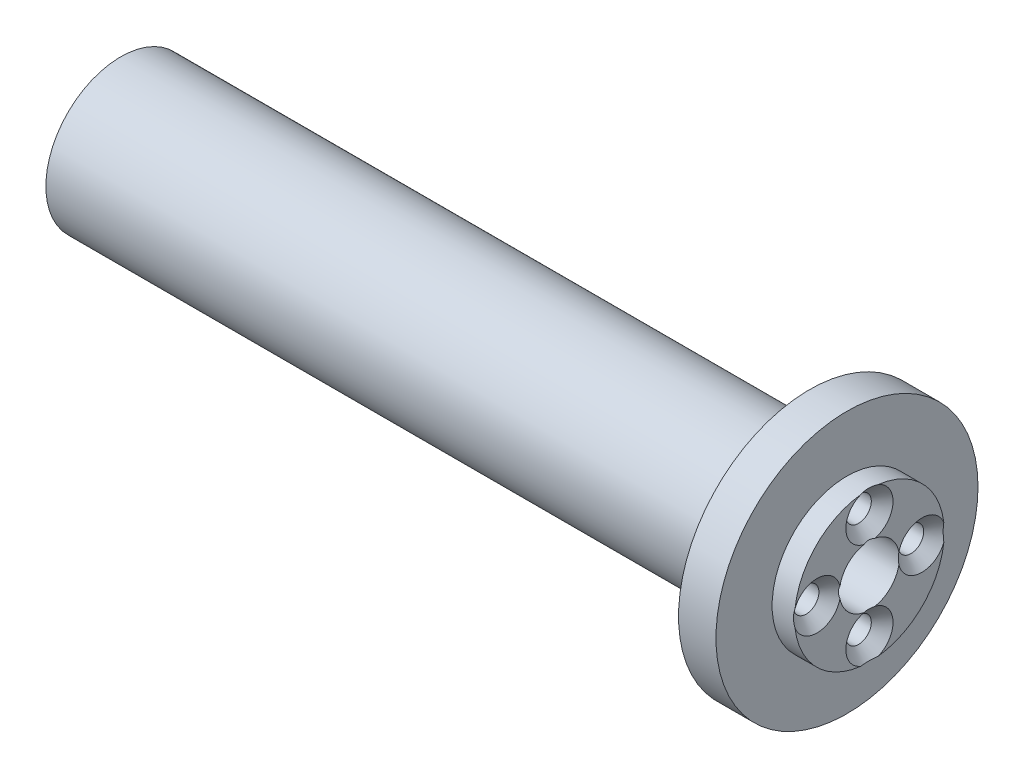
ISO-10303-21;
HEADER;
FILE_DESCRIPTION(('STEP AP214'),'2;1');
FILE_NAME('part.step','',(''),(''),'','','');
FILE_SCHEMA(('AUTOMOTIVE_DESIGN { 1 0 10303 214 1 1 1 1 }'));
ENDSEC;
DATA;
#1=APPLICATION_CONTEXT('core data for automotive mechanical design processes');
#2=APPLICATION_PROTOCOL_DEFINITION('international standard','automotive_design',2000,#1);
#3=PRODUCT_CONTEXT('',#1,'mechanical');
#4=PRODUCT('Part','Part','',(#3));
#5=PRODUCT_RELATED_PRODUCT_CATEGORY('part','',(#4));
#6=PRODUCT_DEFINITION_FORMATION('','',#4);
#7=PRODUCT_DEFINITION_CONTEXT('part definition',#1,'design');
#8=PRODUCT_DEFINITION('design','',#6,#7);
#9=PRODUCT_DEFINITION_SHAPE('','',#8);
#10=(LENGTH_UNIT() NAMED_UNIT(*) SI_UNIT(.MILLI.,.METRE.));
#11=(NAMED_UNIT(*) PLANE_ANGLE_UNIT() SI_UNIT($,.RADIAN.));
#12=(NAMED_UNIT(*) SI_UNIT($,.STERADIAN.) SOLID_ANGLE_UNIT());
#13=UNCERTAINTY_MEASURE_WITH_UNIT(LENGTH_MEASURE(1.E-05),#10,'distance_accuracy_value','');
#14=(GEOMETRIC_REPRESENTATION_CONTEXT(3) GLOBAL_UNCERTAINTY_ASSIGNED_CONTEXT((#13)) GLOBAL_UNIT_ASSIGNED_CONTEXT((#10,
#11,#12)) REPRESENTATION_CONTEXT('',''));
#15=CARTESIAN_POINT('',(0.,0.,0.));
#16=DIRECTION('',(0.,0.,1.));
#17=DIRECTION('',(1.,0.,0.));
#18=AXIS2_PLACEMENT_3D('',#15,#16,#17);
#19=CARTESIAN_POINT('',(0.,0.,0.));
#20=DIRECTION('',(-1.,0.,0.));
#21=DIRECTION('',(0.,0.,1.));
#22=AXIS2_PLACEMENT_3D('',#19,#20,#21);
#23=PLANE('',#22);
#24=CARTESIAN_POINT('',(0.,7.,0.));
#25=DIRECTION('',(1.,0.,0.));
#26=DIRECTION('',(0.,0.,-1.));
#27=AXIS2_PLACEMENT_3D('',#24,#25,#26);
#28=CIRCLE('',#27,3.15);
#29=CARTESIAN_POINT('',(0.,9.93410714285714,1.14608694008556));
#30=VERTEX_POINT('',#29);
#31=CARTESIAN_POINT('',(0.,3.93410714285714,0.72304978287833));
#32=VERTEX_POINT('',#31);
#33=EDGE_CURVE('E113',#30,#32,#28,.T.);
#34=ORIENTED_EDGE('',*,*,#33,.F.);
#35=CARTESIAN_POINT('',(0.,0.,0.));
#36=DIRECTION('',(1.,0.,0.));
#37=DIRECTION('',(0.,0.,-1.));
#38=AXIS2_PLACEMENT_3D('',#35,#36,#37);
#39=CIRCLE('',#38,10.);
#40=CARTESIAN_POINT('',(0.,1.14608694008556,9.93410714285714));
#41=VERTEX_POINT('',#40);
#42=EDGE_CURVE('E122',#30,#41,#39,.T.);
#43=ORIENTED_EDGE('',*,*,#42,.T.);
#44=CARTESIAN_POINT('',(0.,0.,7.));
#45=DIRECTION('',(1.,0.,0.));
#46=DIRECTION('',(0.,0.,-1.));
#47=AXIS2_PLACEMENT_3D('',#44,#45,#46);
#48=CIRCLE('',#47,3.15);
#49=CARTESIAN_POINT('',(0.,0.72304978287833,3.93410714285714));
#50=VERTEX_POINT('',#49);
#51=EDGE_CURVE('E209',#50,#41,#48,.T.);
#52=ORIENTED_EDGE('',*,*,#51,.F.);
#53=CARTESIAN_POINT('',(0.,0.,0.));
#54=DIRECTION('',(1.,0.,0.));
#55=DIRECTION('',(0.,0.,-1.));
#56=AXIS2_PLACEMENT_3D('',#53,#54,#55);
#57=CIRCLE('',#56,4.);
#58=EDGE_CURVE('E124',#32,#50,#57,.T.);
#59=ORIENTED_EDGE('',*,*,#58,.F.);
#60=EDGE_LOOP('',(#34,#43,#52,#59));
#61=FACE_BOUND('',#60,.T.);
#62=ADVANCED_FACE('F48',(#61),#23,.F.);
#63=CARTESIAN_POINT('',(0.,3.93410714285714,-0.72304978287833));
#64=VERTEX_POINT('',#63);
#65=CARTESIAN_POINT('',(0.,9.93410714285714,-1.14608694008555));
#66=VERTEX_POINT('',#65);
#67=EDGE_CURVE('E65',#64,#66,#28,.T.);
#68=ORIENTED_EDGE('',*,*,#67,.F.);
#69=CARTESIAN_POINT('',(0.,0.72304978287833,-3.93410714285714));
#70=VERTEX_POINT('',#69);
#71=EDGE_CURVE('E430',#70,#64,#57,.T.);
#72=ORIENTED_EDGE('',*,*,#71,.F.);
#73=CARTESIAN_POINT('',(0.,0.,-7.));
#74=DIRECTION('',(1.,0.,0.));
#75=DIRECTION('',(0.,0.,-1.));
#76=AXIS2_PLACEMENT_3D('',#73,#74,#75);
#77=CIRCLE('',#76,3.15);
#78=CARTESIAN_POINT('',(0.,1.14608694008556,-9.93410714285714));
#79=VERTEX_POINT('',#78);
#80=EDGE_CURVE('E417',#79,#70,#77,.T.);
#81=ORIENTED_EDGE('',*,*,#80,.F.);
#82=EDGE_CURVE('E132',#79,#66,#39,.T.);
#83=ORIENTED_EDGE('',*,*,#82,.T.);
#84=EDGE_LOOP('',(#68,#72,#81,#83));
#85=FACE_BOUND('',#84,.T.);
#86=ADVANCED_FACE('F289',(#85),#23,.F.);
#87=CARTESIAN_POINT('',(0.,-0.72304978287833,-3.93410714285714));
#88=VERTEX_POINT('',#87);
#89=CARTESIAN_POINT('',(0.,-1.14608694008555,-9.93410714285714));
#90=VERTEX_POINT('',#89);
#91=EDGE_CURVE('E72',#88,#90,#77,.T.);
#92=ORIENTED_EDGE('',*,*,#91,.F.);
#93=CARTESIAN_POINT('',(0.,-3.93410714285714,-0.72304978287833));
#94=VERTEX_POINT('',#93);
#95=EDGE_CURVE('E138',#94,#88,#57,.T.);
#96=ORIENTED_EDGE('',*,*,#95,.F.);
#97=CARTESIAN_POINT('',(0.,-7.,0.));
#98=DIRECTION('',(1.,0.,0.));
#99=DIRECTION('',(0.,0.,-1.));
#100=AXIS2_PLACEMENT_3D('',#97,#98,#99);
#101=CIRCLE('',#100,3.15);
#102=CARTESIAN_POINT('',(0.,-9.93410714285714,-1.14608694008556));
#103=VERTEX_POINT('',#102);
#104=EDGE_CURVE('E155',#103,#94,#101,.T.);
#105=ORIENTED_EDGE('',*,*,#104,.F.);
#106=EDGE_CURVE('E136',#103,#90,#39,.T.);
#107=ORIENTED_EDGE('',*,*,#106,.T.);
#108=EDGE_LOOP('',(#92,#96,#105,#107));
#109=FACE_BOUND('',#108,.T.);
#110=ADVANCED_FACE('F152',(#109),#23,.F.);
#111=CARTESIAN_POINT('',(0.,-1.14608694008556,9.93410714285714));
#112=VERTEX_POINT('',#111);
#113=CARTESIAN_POINT('',(0.,-9.93410714285714,1.14608694008555));
#114=VERTEX_POINT('',#113);
#115=EDGE_CURVE('E135',#112,#114,#39,.T.);
#116=ORIENTED_EDGE('',*,*,#115,.T.);
#117=CARTESIAN_POINT('',(0.,-3.93410714285714,0.72304978287833));
#118=VERTEX_POINT('',#117);
#119=EDGE_CURVE('E198',#118,#114,#101,.T.);
#120=ORIENTED_EDGE('',*,*,#119,.F.);
#121=CARTESIAN_POINT('',(0.,-0.72304978287833,3.93410714285714));
#122=VERTEX_POINT('',#121);
#123=EDGE_CURVE('E133',#122,#118,#57,.T.);
#124=ORIENTED_EDGE('',*,*,#123,.F.);
#125=EDGE_CURVE('E253',#112,#122,#48,.T.);
#126=ORIENTED_EDGE('',*,*,#125,.F.);
#127=EDGE_LOOP('',(#116,#120,#124,#126));
#128=FACE_BOUND('',#127,.T.);
#129=ADVANCED_FACE('F263',(#128),#23,.F.);
#130=CARTESIAN_POINT('',(-8.,0.,0.));
#131=DIRECTION('',(-1.,0.,0.));
#132=DIRECTION('',(0.,0.,1.));
#133=AXIS2_PLACEMENT_3D('',#130,#131,#132);
#134=PLANE('',#133);
#135=CARTESIAN_POINT('',(-8.,7.,0.));
#136=DIRECTION('',(-1.,0.,0.));
#137=DIRECTION('',(0.,0.,1.));
#138=AXIS2_PLACEMENT_3D('',#135,#136,#137);
#139=CIRCLE('',#138,1.69999999999999);
#140=CARTESIAN_POINT('',(-8.,7.,1.69999999999999));
#141=VERTEX_POINT('',#140);
#142=EDGE_CURVE('E53',#141,#141,#139,.T.);
#143=ORIENTED_EDGE('',*,*,#142,.F.);
#144=EDGE_LOOP('',(#143));
#145=FACE_BOUND('',#144,.T.);
#146=CARTESIAN_POINT('',(-8.,0.,-7.));
#147=DIRECTION('',(-1.,0.,0.));
#148=DIRECTION('',(0.,0.,1.));
#149=AXIS2_PLACEMENT_3D('',#146,#147,#148);
#150=CIRCLE('',#149,1.69999999999999);
#151=CARTESIAN_POINT('',(-8.,0.,-5.30000000000001));
#152=VERTEX_POINT('',#151);
#153=EDGE_CURVE('E170',#152,#152,#150,.T.);
#154=ORIENTED_EDGE('',*,*,#153,.F.);
#155=EDGE_LOOP('',(#154));
#156=FACE_BOUND('',#155,.T.);
#157=CARTESIAN_POINT('',(-8.,-7.,0.));
#158=DIRECTION('',(-1.,0.,0.));
#159=DIRECTION('',(0.,0.,1.));
#160=AXIS2_PLACEMENT_3D('',#157,#158,#159);
#161=CIRCLE('',#160,1.69999999999999);
#162=CARTESIAN_POINT('',(-8.,-7.,1.69999999999999));
#163=VERTEX_POINT('',#162);
#164=EDGE_CURVE('E169',#163,#163,#161,.T.);
#165=ORIENTED_EDGE('',*,*,#164,.F.);
#166=EDGE_LOOP('',(#165));
#167=FACE_BOUND('',#166,.T.);
#168=CARTESIAN_POINT('',(-8.,0.,7.));
#169=DIRECTION('',(-1.,0.,0.));
#170=DIRECTION('',(0.,0.,1.));
#171=AXIS2_PLACEMENT_3D('',#168,#169,#170);
#172=CIRCLE('',#171,1.69999999999999);
#173=CARTESIAN_POINT('',(-8.,0.,8.69999999999999));
#174=VERTEX_POINT('',#173);
#175=EDGE_CURVE('E224',#174,#174,#172,.T.);
#176=ORIENTED_EDGE('',*,*,#175,.F.);
#177=EDGE_LOOP('',(#176));
#178=FACE_BOUND('',#177,.T.);
#179=CARTESIAN_POINT('',(-8.,0.,0.));
#180=DIRECTION('',(-1.,0.,0.));
#181=DIRECTION('',(0.,0.,1.));
#182=AXIS2_PLACEMENT_3D('',#179,#180,#181);
#183=CIRCLE('',#182,4.);
#184=CARTESIAN_POINT('',(-8.,0.,4.));
#185=VERTEX_POINT('',#184);
#186=EDGE_CURVE('E227',#185,#185,#183,.F.);
#187=ORIENTED_EDGE('',*,*,#186,.T.);
#188=EDGE_LOOP('',(#187));
#189=FACE_BOUND('',#188,.T.);
#190=CARTESIAN_POINT('',(-8.,0.,0.));
#191=DIRECTION('',(1.,0.,0.));
#192=DIRECTION('',(0.,0.,-1.));
#193=AXIS2_PLACEMENT_3D('',#190,#191,#192);
#194=CIRCLE('',#193,17.5);
#195=CARTESIAN_POINT('',(-8.,0.,-17.5));
#196=VERTEX_POINT('',#195);
#197=EDGE_CURVE('E234',#196,#196,#194,.T.);
#198=ORIENTED_EDGE('',*,*,#197,.F.);
#199=EDGE_LOOP('',(#198));
#200=FACE_BOUND('',#199,.T.);
#201=ADVANCED_FACE('F241',(#145,#156,#167,#178,#189,#200),#134,.T.);
#202=CARTESIAN_POINT('',(0.,0.,0.));
#203=DIRECTION('',(1.,0.,0.));
#204=DIRECTION('',(0.,0.,-1.));
#205=AXIS2_PLACEMENT_3D('',#202,#203,#204);
#206=CYLINDRICAL_SURFACE('',#205,10.);
#207=ORIENTED_EDGE('',*,*,#42,.F.);
#208=CARTESIAN_POINT('',(1.10529391328423,9.34946240796902,3.5478941193297));
#209=CARTESIAN_POINT('',(1.04907264829997,9.38364431797027,3.45780962183444));
#210=CARTESIAN_POINT('',(0.993594835934076,9.4166869097311,3.3668177564348));
#211=CARTESIAN_POINT('',(0.884461815923228,9.48043414001423,3.18290101992952));
#212=CARTESIAN_POINT('',(0.83080719180688,9.51113803384624,3.08997554501497));
#213=CARTESIAN_POINT('',(0.725325809001813,9.57033248267158,2.90147530933876));
#214=CARTESIAN_POINT('',(0.673514407773661,9.59880610815127,2.80588659186287));
#215=CARTESIAN_POINT('',(0.572583653684765,9.65320832212306,2.61259477999553));
#216=CARTESIAN_POINT('',(0.523464079923835,9.67913711959063,2.51489186002308));
#217=CARTESIAN_POINT('',(0.427369925636187,9.72891314252906,2.31497255611052));
#218=CARTESIAN_POINT('',(0.380470879722207,9.75269861532267,2.21270404664197));
#219=CARTESIAN_POINT('',(0.290791560299733,9.79735495590047,2.0057560239992));
#220=CARTESIAN_POINT('',(0.248011962655517,9.81822534566879,1.90107611867464));
#221=CARTESIAN_POINT('',(0.127352684735384,9.87609892913062,1.58388676876449));
#222=CARTESIAN_POINT('',(0.0568077596554927,9.90853954210883,1.36753486741728));
#223=CARTESIAN_POINT('',(-0.0299217344374776,9.94757410537813,1.02944641862924));
#224=CARTESIAN_POINT('',(-0.056097238175055,9.95915953184833,0.910803937255921));
#225=CARTESIAN_POINT('',(-0.0993679839851817,9.97815090974477,0.671489447209664));
#226=CARTESIAN_POINT('',(-0.116462357099749,9.9855564612101,0.550817245455592));
#227=CARTESIAN_POINT('',(-0.140513350068538,9.99593844318791,0.309335401118566));
#228=CARTESIAN_POINT('',(-0.147557671734934,9.99895319492118,0.188536270013584));
#229=CARTESIAN_POINT('',(-0.151374268212403,10.0005890243352,-0.0532180578452432));
#230=CARTESIAN_POINT('',(-0.148149341106092,9.99921129884276,-0.174173203112497));
#231=CARTESIAN_POINT('',(-0.130003390427934,9.99140867101323,-0.438735594187811));
#232=CARTESIAN_POINT('',(-0.112928646944249,9.98405385433666,-0.582170972309429));
#233=CARTESIAN_POINT('',(-0.065699397174807,9.96340348068819,-0.866603018044164));
#234=CARTESIAN_POINT('',(-0.0355223497226249,9.9500976844755,-1.00759504545096));
#235=CARTESIAN_POINT('',(0.0771077297424815,9.89939684827125,-1.44670918999629));
#236=CARTESIAN_POINT('',(0.179718539688524,9.85191529602585,-1.73857793617781));
#237=CARTESIAN_POINT('',(0.357426215311863,9.76439775883319,-2.16278283232573));
#238=CARTESIAN_POINT('',(0.420826843194004,9.73240297256919,-2.30226885145879));
#239=CARTESIAN_POINT('',(0.553824744829527,9.66329146623199,-2.57697671140292));
#240=CARTESIAN_POINT('',(0.623420484307624,9.62617601309291,-2.7121995968455));
#241=CARTESIAN_POINT('',(0.758362001855065,9.55204882522907,-2.96195145440974));
#242=CARTESIAN_POINT('',(0.823152401180091,9.51560348975193,-3.07695511508269));
#243=CARTESIAN_POINT('',(0.955648135943759,9.4391458632028,-3.30406964338384));
#244=CARTESIAN_POINT('',(1.02335361371833,9.39913339785449,-3.41618036932891));
#245=CARTESIAN_POINT('',(1.16035158188826,9.31610755961291,-3.63646150180565));
#246=CARTESIAN_POINT('',(1.22961931897936,9.27313090371577,-3.7446612446837));
#247=CARTESIAN_POINT('',(1.36998761788798,9.18390468080928,-3.95844445788286));
#248=CARTESIAN_POINT('',(1.44108765120168,9.13765605099054,-4.064028665766));
#249=CARTESIAN_POINT('',(1.51290275681031,9.08980984860934,-4.16837581272665));
#250=B_SPLINE_CURVE_WITH_KNOTS('',3,(#208,#209,#210,#211,#212,#213,#214,#215,#216,#217,#218,
#219,#220,#221,#222,#223,#224,#225,#226,#227,#228,#229,#230,#231,#232,#233,#234,#235,#236,#237,
#238,#239,#240,#241,#242,#243,#244,#245,#246,#247,#248,#249),.UNSPECIFIED.,.F.,.F.,(4,2,2,2,2,2,
2,2,2,2,2,2,2,2,2,2,2,2,2,2,4),(0.,0.334665218809981,0.669436560360941,1.00654264201482,
1.34362101808474,1.68846868120882,2.03337282629586,2.7208107620489,3.08660554123136,
3.45243531639376,3.81505272993039,4.17757134883501,4.61062861980551,5.04443389183376,
5.97838641402409,6.44785276323829,6.91720316664569,7.32791367433452,7.73864425877521,
8.14497723005486,8.55119428304706),.UNSPECIFIED.);
#251=EDGE_CURVE('E13',#30,#66,#250,.T.);
#252=ORIENTED_EDGE('',*,*,#251,.T.);
#253=ORIENTED_EDGE('',*,*,#82,.F.);
#254=CARTESIAN_POINT('',(1.10529391328423,3.54789411932969,-9.34946240796902));
#255=CARTESIAN_POINT('',(1.04907264829997,3.45780962183444,-9.38364431797027));
#256=CARTESIAN_POINT('',(0.993594835934075,3.3668177564348,-9.4166869097311));
#257=CARTESIAN_POINT('',(0.884461815923227,3.18290101992951,-9.48043414001423));
#258=CARTESIAN_POINT('',(0.83080719180688,3.08997554501496,-9.51113803384624));
#259=CARTESIAN_POINT('',(0.725325809001813,2.90147530933876,-9.57033248267158));
#260=CARTESIAN_POINT('',(0.673514407773661,2.80588659186287,-9.59880610815127));
#261=CARTESIAN_POINT('',(0.572583653684765,2.61259477999553,-9.65320832212306));
#262=CARTESIAN_POINT('',(0.523464079923836,2.51489186002308,-9.67913711959063));
#263=CARTESIAN_POINT('',(0.427369925636188,2.31497255611052,-9.72891314252906));
#264=CARTESIAN_POINT('',(0.380470879722207,2.21270404664197,-9.75269861532267));
#265=CARTESIAN_POINT('',(0.290791560299733,2.0057560239992,-9.79735495590047));
#266=CARTESIAN_POINT('',(0.248011962655518,1.90107611867464,-9.81822534566879));
#267=CARTESIAN_POINT('',(0.127352684735384,1.58388676876449,-9.87609892913062));
#268=CARTESIAN_POINT('',(0.0568077596554936,1.36753486741728,-9.90853954210883));
#269=CARTESIAN_POINT('',(-0.0299217344374768,1.02944641862924,-9.94757410537813));
#270=CARTESIAN_POINT('',(-0.0560972381750545,0.910803937255923,-9.95915953184833));
#271=CARTESIAN_POINT('',(-0.0993679839851814,0.671489447209666,-9.97815090974477));
#272=CARTESIAN_POINT('',(-0.116462357099748,0.550817245455594,-9.9855564612101));
#273=CARTESIAN_POINT('',(-0.140513350068537,0.309335401118568,-9.99593844318791));
#274=CARTESIAN_POINT('',(-0.147557671734934,0.188536270013585,-9.99895319492118));
#275=CARTESIAN_POINT('',(-0.151374268212403,-0.0532180578452413,-10.0005890243352));
#276=CARTESIAN_POINT('',(-0.148149341106092,-0.174173203112495,-9.99921129884276));
#277=CARTESIAN_POINT('',(-0.130003390427933,-0.43873559418781,-9.99140867101323));
#278=CARTESIAN_POINT('',(-0.112928646944248,-0.582170972309428,-9.98405385433666));
#279=CARTESIAN_POINT('',(-0.0656993971748058,-0.866603018044163,-9.96340348068819));
#280=CARTESIAN_POINT('',(-0.0355223497226245,-1.00759504545096,-9.9500976844755));
#281=CARTESIAN_POINT('',(0.0771077297424805,-1.44670918999629,-9.89939684827125));
#282=CARTESIAN_POINT('',(0.179718539688524,-1.73857793617781,-9.85191529602585));
#283=CARTESIAN_POINT('',(0.357426215311863,-2.16278283232573,-9.76439775883319));
#284=CARTESIAN_POINT('',(0.420826843194004,-2.30226885145879,-9.73240297256919));
#285=CARTESIAN_POINT('',(0.553824744829527,-2.57697671140292,-9.66329146623199));
#286=CARTESIAN_POINT('',(0.623420484307623,-2.7121995968455,-9.62617601309291));
#287=CARTESIAN_POINT('',(0.758362001855065,-2.96195145440974,-9.55204882522907));
#288=CARTESIAN_POINT('',(0.823152401180092,-3.07695511508269,-9.51560348975193));
#289=CARTESIAN_POINT('',(0.955648135943759,-3.30406964338384,-9.4391458632028));
#290=CARTESIAN_POINT('',(1.02335361371833,-3.41618036932891,-9.39913339785449));
#291=CARTESIAN_POINT('',(1.16035158188826,-3.63646150180565,-9.31610755961291));
#292=CARTESIAN_POINT('',(1.22961931897936,-3.7446612446837,-9.27313090371577));
#293=CARTESIAN_POINT('',(1.36998761788798,-3.95844445788286,-9.18390468080928));
#294=CARTESIAN_POINT('',(1.44108765120168,-4.06402866576599,-9.13765605099055));
#295=CARTESIAN_POINT('',(1.51290275681031,-4.16837581272665,-9.08980984860934));
#296=B_SPLINE_CURVE_WITH_KNOTS('',3,(#254,#255,#256,#257,#258,#259,#260,#261,#262,#263,#264,
#265,#266,#267,#268,#269,#270,#271,#272,#273,#274,#275,#276,#277,#278,#279,#280,#281,#282,#283,
#284,#285,#286,#287,#288,#289,#290,#291,#292,#293,#294,#295),.UNSPECIFIED.,.F.,.F.,(4,2,2,2,2,2,
2,2,2,2,2,2,2,2,2,2,2,2,2,2,4),(0.,0.334665218809981,0.66943656036094,1.00654264201482,
1.34362101808473,1.68846868120882,2.03337282629585,2.7208107620489,3.08660554123136,
3.45243531639375,3.81505272993039,4.17757134883501,4.61062861980551,5.04443389183376,
5.97838641402409,6.44785276323829,6.91720316664569,7.32791367433452,7.7386442587752,
8.14497723005486,8.55119428304706),.UNSPECIFIED.);
#297=EDGE_CURVE('E58',#79,#90,#296,.T.);
#298=ORIENTED_EDGE('',*,*,#297,.T.);
#299=ORIENTED_EDGE('',*,*,#106,.F.);
#300=CARTESIAN_POINT('',(1.51290275681031,-9.08980984860934,-4.16837581272665));
#301=CARTESIAN_POINT('',(1.45024519717872,-9.13155224617286,-4.07734404137232));
#302=CARTESIAN_POINT('',(1.38813853802477,-9.17207761777815,-3.98536860760191));
#303=CARTESIAN_POINT('',(1.26528286275646,-9.25064542574539,-3.79944196642204));
#304=CARTESIAN_POINT('',(1.2045341259964,-9.28868735424457,-3.70549036004802));
#305=CARTESIAN_POINT('',(1.08439677076522,-9.3623935792794,-3.51511766307902));
#306=CARTESIAN_POINT('',(1.02501580524429,-9.39804597618262,-3.41868710854142));
#307=CARTESIAN_POINT('',(0.908273343570119,-9.46670223066742,-3.22369763594898));
#308=CARTESIAN_POINT('',(0.850911716492084,-9.49970626013538,-3.12513885654958));
#309=CARTESIAN_POINT('',(0.682179904959883,-9.59478663837016,-2.8256120556367));
#310=CARTESIAN_POINT('',(0.574448992204259,-9.65275720786919,-2.62124021536922));
#311=CARTESIAN_POINT('',(0.373602613871861,-9.7567337930982,-2.20283063092729));
#312=CARTESIAN_POINT('',(0.280455424055077,-9.80276592617862,-1.98881520940315));
#313=CARTESIAN_POINT('',(0.178985524838943,-9.85130206085841,-1.71886747837725));
#314=CARTESIAN_POINT('',(0.160479676045281,-9.86007472612662,-1.66782208029866));
#315=CARTESIAN_POINT('',(0.124731520084915,-9.87688932753872,-1.56517187958713));
#316=CARTESIAN_POINT('',(0.107489185227013,-9.88493127969787,-1.51356708924232));
#317=CARTESIAN_POINT('',(0.0577887555791993,-9.90794218860265,-1.35782937234135));
#318=CARTESIAN_POINT('',(0.0273895245396099,-9.92178085402564,-1.25285804409211));
#319=CARTESIAN_POINT('',(-0.0297966660735771,-9.94751674290107,-1.02993265426375));
#320=CARTESIAN_POINT('',(-0.0558866500496616,-9.95906601573134,-0.911757122322591));
#321=CARTESIAN_POINT('',(-0.0990614004505352,-9.97801743211655,-0.673393845873134));
#322=CARTESIAN_POINT('',(-0.116144374535883,-9.98541875027251,-0.553205705773967));
#323=CARTESIAN_POINT('',(-0.140352364053542,-9.99586940407514,-0.311735747307056));
#324=CARTESIAN_POINT('',(-0.147486544632132,-9.99892274527194,-0.19045503927271));
#325=CARTESIAN_POINT('',(-0.15139953804006,-10.0005998173116,0.0522621756968732));
#326=CARTESIAN_POINT('',(-0.148181719865752,-9.99922498927558,0.173698619090711));
#327=CARTESIAN_POINT('',(-0.129993151069418,-9.99140454474894,0.438887872645632));
#328=CARTESIAN_POINT('',(-0.11289336631793,-9.98403986593671,0.582469292718405));
#329=CARTESIAN_POINT('',(-0.0656332181199575,-9.96337310685192,0.866915295235875));
#330=CARTESIAN_POINT('',(-0.0354783186225069,-9.95007351044518,1.00778098855718));
#331=CARTESIAN_POINT('',(0.0282898852356632,-9.92137580429474,1.25637040829675));
#332=CARTESIAN_POINT('',(0.0598034978029299,-9.90702566424043,1.3647707443452));
#333=CARTESIAN_POINT('',(0.154178617788677,-9.86328396748094,1.65868834114055));
#334=CARTESIAN_POINT('',(0.222965340437453,-9.83062613013543,1.8418284118718));
#335=CARTESIAN_POINT('',(0.373498616705081,-9.75647332991037,2.2011327601914));
#336=CARTESIAN_POINT('',(0.455270938810105,-9.71496073831859,2.37728227827569));
#337=CARTESIAN_POINT('',(0.58493641090139,-9.64658142778301,2.63656361209072));
#338=CARTESIAN_POINT('',(0.629381005459108,-9.62273909538873,2.72226221618728));
#339=CARTESIAN_POINT('',(0.720253293656193,-9.57308572924006,2.89203286893842));
#340=CARTESIAN_POINT('',(0.766681106707077,-9.54727457686739,2.97610481920652));
#341=CARTESIAN_POINT('',(0.861009544205289,-9.49385831571755,3.14233111568579));
#342=CARTESIAN_POINT('',(0.908903140544853,-9.46626122202728,3.22449204794775));
#343=CARTESIAN_POINT('',(1.0060993141286,-9.40922930180665,3.38730479492972));
#344=CARTESIAN_POINT('',(1.05540159327579,-9.3797948625452,3.46795692304315));
#345=CARTESIAN_POINT('',(1.10529391328423,-9.34946240796902,3.5478941193297));
#346=B_SPLINE_CURVE_WITH_KNOTS('',3,(#300,#301,#302,#303,#304,#305,#306,#307,#308,#309,#310,
#311,#312,#313,#314,#315,#316,#317,#318,#319,#320,#321,#322,#323,#324,#325,#326,#327,#328,#329,
#330,#331,#332,#333,#334,#335,#336,#337,#338,#339,#340,#341,#342,#343,#344,#345),.UNSPECIFIED.,
.F.,.F.,(4,2,2,2,2,2,2,2,2,2,2,2,2,2,2,2,2,2,2,2,2,2,4),(0.,0.354391715419845,0.708855678184183,
1.06497063397704,1.42106245820022,2.13491727219098,2.84719697769724,3.01218173505394,
3.17716287551922,3.5074012012974,3.8717344859282,4.23614024329984,4.60021007618538,
4.9641614366991,5.39768330237807,5.83102390155998,6.17219714538969,6.76618085054541,
7.3613583285954,7.65963114818026,7.95792195244665,8.2549562033459,8.55192805649591),.UNSPECIFIED.);
#347=EDGE_CURVE('E157',#103,#114,#346,.T.);
#348=ORIENTED_EDGE('',*,*,#347,.T.);
#349=ORIENTED_EDGE('',*,*,#115,.F.);
#350=CARTESIAN_POINT('',(1.51290275681031,-4.16837581272665,9.08980984860935));
#351=CARTESIAN_POINT('',(1.45024519717872,-4.07734404137232,9.13155224617286));
#352=CARTESIAN_POINT('',(1.38813853802477,-3.98536860760191,9.17207761777815));
#353=CARTESIAN_POINT('',(1.26528286275646,-3.79944196642204,9.25064542574539));
#354=CARTESIAN_POINT('',(1.20453412599639,-3.70549036004802,9.28868735424457));
#355=CARTESIAN_POINT('',(1.08439677076522,-3.51511766307902,9.3623935792794));
#356=CARTESIAN_POINT('',(1.02501580524429,-3.41868710854142,9.39804597618261));
#357=CARTESIAN_POINT('',(0.908273343570118,-3.22369763594898,9.46670223066742));
#358=CARTESIAN_POINT('',(0.850911716492083,-3.12513885654958,9.49970626013538));
#359=CARTESIAN_POINT('',(0.682179904959883,-2.8256120556367,9.59478663837016));
#360=CARTESIAN_POINT('',(0.574448992204258,-2.62124021536922,9.65275720786919));
#361=CARTESIAN_POINT('',(0.37360261387186,-2.20283063092729,9.7567337930982));
#362=CARTESIAN_POINT('',(0.280455424055075,-1.98881520940315,9.80276592617862));
#363=CARTESIAN_POINT('',(0.178985524838943,-1.71886747837725,9.85130206085841));
#364=CARTESIAN_POINT('',(0.160479676045281,-1.66782208029866,9.86007472612662));
#365=CARTESIAN_POINT('',(0.124731520084915,-1.56517187958713,9.87688932753872));
#366=CARTESIAN_POINT('',(0.107489185227012,-1.51356708924231,9.88493127969787));
#367=CARTESIAN_POINT('',(0.0577887555791984,-1.35782937234135,9.90794218860265));
#368=CARTESIAN_POINT('',(0.0273895245396096,-1.25285804409211,9.92178085402564));
#369=CARTESIAN_POINT('',(-0.0297966660735769,-1.02993265426374,9.94751674290107));
#370=CARTESIAN_POINT('',(-0.0558866500496614,-0.911757122322591,9.95906601573134));
#371=CARTESIAN_POINT('',(-0.0990614004505354,-0.673393845873134,9.97801743211655));
#372=CARTESIAN_POINT('',(-0.116144374535883,-0.553205705773966,9.98541875027251));
#373=CARTESIAN_POINT('',(-0.140352364053542,-0.311735747307056,9.99586940407515));
#374=CARTESIAN_POINT('',(-0.147486544632131,-0.19045503927271,9.99892274527194));
#375=CARTESIAN_POINT('',(-0.151399538040058,0.0522621756968734,10.0005998173116));
#376=CARTESIAN_POINT('',(-0.148181719865751,0.173698619090711,9.99922498927558));
#377=CARTESIAN_POINT('',(-0.129993151069419,0.438887872645632,9.99140454474894));
#378=CARTESIAN_POINT('',(-0.112893366317929,0.582469292718405,9.98403986593671));
#379=CARTESIAN_POINT('',(-0.0656332181199568,0.866915295235875,9.96337310685192));
#380=CARTESIAN_POINT('',(-0.0354783186225065,1.00778098855718,9.95007351044518));
#381=CARTESIAN_POINT('',(0.0282898852356634,1.25637040829675,9.92137580429474));
#382=CARTESIAN_POINT('',(0.0598034978029301,1.3647707443452,9.90702566424043));
#383=CARTESIAN_POINT('',(0.154178617788677,1.65868834114055,9.86328396748094));
#384=CARTESIAN_POINT('',(0.222965340437454,1.8418284118718,9.83062613013544));
#385=CARTESIAN_POINT('',(0.373498616705081,2.2011327601914,9.75647332991037));
#386=CARTESIAN_POINT('',(0.455270938810104,2.37728227827569,9.71496073831859));
#387=CARTESIAN_POINT('',(0.58493641090139,2.63656361209072,9.64658142778301));
#388=CARTESIAN_POINT('',(0.629381005459108,2.72226221618728,9.62273909538873));
#389=CARTESIAN_POINT('',(0.720253293656194,2.89203286893842,9.57308572924006));
#390=CARTESIAN_POINT('',(0.766681106707078,2.97610481920652,9.54727457686739));
#391=CARTESIAN_POINT('',(0.861009544205289,3.14233111568578,9.49385831571755));
#392=CARTESIAN_POINT('',(0.908903140544853,3.22449204794775,9.46626122202728));
#393=CARTESIAN_POINT('',(1.0060993141286,3.38730479492971,9.40922930180665));
#394=CARTESIAN_POINT('',(1.05540159327579,3.46795692304315,9.3797948625452));
#395=CARTESIAN_POINT('',(1.10529391328423,3.54789411932969,9.34946240796902));
#396=B_SPLINE_CURVE_WITH_KNOTS('',3,(#350,#351,#352,#353,#354,#355,#356,#357,#358,#359,#360,
#361,#362,#363,#364,#365,#366,#367,#368,#369,#370,#371,#372,#373,#374,#375,#376,#377,#378,#379,
#380,#381,#382,#383,#384,#385,#386,#387,#388,#389,#390,#391,#392,#393,#394,#395),.UNSPECIFIED.,
.F.,.F.,(4,2,2,2,2,2,2,2,2,2,2,2,2,2,2,2,2,2,2,2,2,2,4),(0.,0.354391715419845,0.708855678184182,
1.06497063397704,1.42106245820022,2.13491727219097,2.84719697769724,3.01218173505394,
3.17716287551922,3.5074012012974,3.8717344859282,4.23614024329983,4.60021007618538,
4.96416143669909,5.39768330237806,5.83102390155998,6.17219714538968,6.76618085054541,
7.36135832859539,7.65963114818025,7.95792195244665,8.2549562033459,8.55192805649591),.UNSPECIFIED.);
#397=EDGE_CURVE('E131',#112,#41,#396,.T.);
#398=ORIENTED_EDGE('',*,*,#397,.T.);
#399=EDGE_LOOP('',(#207,#252,#253,#298,#299,#348,#349,#398));
#400=FACE_BOUND('',#399,.T.);
#401=CARTESIAN_POINT('',(-3.,0.,0.));
#402=DIRECTION('',(1.,0.,0.));
#403=DIRECTION('',(0.,0.,-1.));
#404=AXIS2_PLACEMENT_3D('',#401,#402,#403);
#405=CIRCLE('',#404,10.);
#406=CARTESIAN_POINT('',(-3.,0.,-10.));
#407=VERTEX_POINT('',#406);
#408=EDGE_CURVE('E142',#407,#407,#405,.T.);
#409=ORIENTED_EDGE('',*,*,#408,.T.);
#410=EDGE_LOOP('',(#409));
#411=FACE_BOUND('',#410,.T.);
#412=ADVANCED_FACE('F128',(#400,#411),#206,.T.);
#413=CARTESIAN_POINT('',(-3.,0.,0.));
#414=DIRECTION('',(-1.,0.,0.));
#415=DIRECTION('',(0.,0.,1.));
#416=AXIS2_PLACEMENT_3D('',#413,#414,#415);
#417=PLANE('',#416);
#418=ORIENTED_EDGE('',*,*,#408,.F.);
#419=EDGE_LOOP('',(#418));
#420=FACE_BOUND('',#419,.T.);
#421=CARTESIAN_POINT('',(-3.,0.,0.));
#422=DIRECTION('',(1.,0.,0.));
#423=DIRECTION('',(0.,0.,-1.));
#424=AXIS2_PLACEMENT_3D('',#421,#422,#423);
#425=CIRCLE('',#424,17.5);
#426=CARTESIAN_POINT('',(-3.,0.,-17.5));
#427=VERTEX_POINT('',#426);
#428=EDGE_CURVE('E147',#427,#427,#425,.T.);
#429=ORIENTED_EDGE('',*,*,#428,.T.);
#430=EDGE_LOOP('',(#429));
#431=FACE_BOUND('',#430,.T.);
#432=ADVANCED_FACE('F277',(#420,#431),#417,.F.);
#433=CARTESIAN_POINT('',(0.,0.,0.));
#434=DIRECTION('',(1.,0.,0.));
#435=DIRECTION('',(0.,0.,-1.));
#436=AXIS2_PLACEMENT_3D('',#433,#434,#435);
#437=CYLINDRICAL_SURFACE('',#436,17.5);
#438=ORIENTED_EDGE('',*,*,#197,.T.);
#439=EDGE_LOOP('',(#438));
#440=FACE_BOUND('',#439,.T.);
#441=ORIENTED_EDGE('',*,*,#428,.F.);
#442=EDGE_LOOP('',(#441));
#443=FACE_BOUND('',#442,.T.);
#444=ADVANCED_FACE('F279',(#440,#443),#437,.T.);
#445=CARTESIAN_POINT('',(0.,0.,0.));
#446=DIRECTION('',(1.,0.,0.));
#447=DIRECTION('',(0.,0.,-1.));
#448=AXIS2_PLACEMENT_3D('',#445,#446,#447);
#449=CYLINDRICAL_SURFACE('',#448,4.);
#450=ORIENTED_EDGE('',*,*,#71,.T.);
#451=CARTESIAN_POINT('',(0.000200000003687819,3.93401713999834,-0.72353931627747));
#452=CARTESIAN_POINT('',(-0.0179484155329109,3.94218489158167,-0.679121832535443));
#453=CARTESIAN_POINT('',(-0.034797305569726,3.94969646806259,-0.634052731144405));
#454=CARTESIAN_POINT('',(-0.065503751932445,3.9632939966324,-0.542629866395042));
#455=CARTESIAN_POINT('',(-0.079357078355736,3.96937793383397,-0.496274389410076));
#456=CARTESIAN_POINT('',(-0.115658802934124,3.98524099465254,-0.355894575099472));
#457=CARTESIAN_POINT('',(-0.133010087113497,3.9927028097288,-0.260178065135983));
#458=CARTESIAN_POINT('',(-0.151481021317659,4.0006419424892,-0.0660735734107557));
#459=CARTESIAN_POINT('',(-0.15246637670351,4.00106147328225,0.0323298803449856));
#460=CARTESIAN_POINT('',(-0.137687067517813,3.99471511181414,0.227587027681247));
#461=CARTESIAN_POINT('',(-0.121926461068741,3.98795096040642,0.324441090960117));
#462=CARTESIAN_POINT('',(-0.0864454176405647,3.97248438938099,0.47132848444341));
#463=CARTESIAN_POINT('',(-0.0716648441844482,3.96600907525232,0.522892663371075));
#464=CARTESIAN_POINT('',(-0.0383808843475887,3.95129328559422,0.624418705156649));
#465=CARTESIAN_POINT('',(-0.0198862222523699,3.94305694378739,0.674384010654415));
#466=CARTESIAN_POINT('',(0.000200000003687574,3.93401713999834,0.72353931627747));
#467=B_SPLINE_CURVE_WITH_KNOTS('',3,(#451,#452,#453,#454,#455,#456,#457,#458,#459,#460,#461,
#462,#463,#464,#465,#466),.UNSPECIFIED.,.F.,.F.,(4,2,2,2,2,2,2,4),(0.,0.145975967382411,
0.292156734046516,0.583278106922899,0.876787178087926,1.17022513812962,1.33216000992457,
1.49371885947694),.UNSPECIFIED.);
#468=EDGE_CURVE('E410',#64,#32,#467,.T.);
#469=ORIENTED_EDGE('',*,*,#468,.T.);
#470=ORIENTED_EDGE('',*,*,#58,.T.);
#471=CARTESIAN_POINT('',(0.000200000003687718,0.723539316277469,3.93401713999834));
#472=CARTESIAN_POINT('',(-0.0179484155329117,0.679121832535442,3.94218489158167));
#473=CARTESIAN_POINT('',(-0.0347973055697269,0.634052731144404,3.94969646806259));
#474=CARTESIAN_POINT('',(-0.0655037519324456,0.542629866395041,3.9632939966324));
#475=CARTESIAN_POINT('',(-0.0793570783557363,0.496274389410075,3.96937793383397));
#476=CARTESIAN_POINT('',(-0.115658802934124,0.355894575099471,3.98524099465254));
#477=CARTESIAN_POINT('',(-0.133010087113496,0.260178065135982,3.9927028097288));
#478=CARTESIAN_POINT('',(-0.151481021317659,0.066073573410755,4.0006419424892));
#479=CARTESIAN_POINT('',(-0.15246637670351,-0.0323298803449865,4.00106147328226));
#480=CARTESIAN_POINT('',(-0.137687067517812,-0.227587027681248,3.99471511181414));
#481=CARTESIAN_POINT('',(-0.12192646106874,-0.324441090960118,3.98795096040642));
#482=CARTESIAN_POINT('',(-0.0864454176405638,-0.471328484443411,3.97248438938099));
#483=CARTESIAN_POINT('',(-0.0716648441844476,-0.522892663371076,3.96600907525232));
#484=CARTESIAN_POINT('',(-0.0383808843475884,-0.62441870515665,3.95129328559422));
#485=CARTESIAN_POINT('',(-0.0198862222523698,-0.674384010654415,3.94305694378739));
#486=CARTESIAN_POINT('',(0.000200000003688009,-0.72353931627747,3.93401713999834));
#487=B_SPLINE_CURVE_WITH_KNOTS('',3,(#471,#472,#473,#474,#475,#476,#477,#478,#479,#480,#481,
#482,#483,#484,#485,#486),.UNSPECIFIED.,.F.,.F.,(4,2,2,2,2,2,2,4),(0.,0.145975967382411,
0.292156734046516,0.583278106922899,0.876787178087926,1.17022513812962,1.33216000992457,
1.49371885947694),.UNSPECIFIED.);
#488=EDGE_CURVE('E228',#50,#122,#487,.T.);
#489=ORIENTED_EDGE('',*,*,#488,.T.);
#490=ORIENTED_EDGE('',*,*,#123,.T.);
#491=CARTESIAN_POINT('',(0.000200000003687718,-3.93401713999834,0.723539316277469));
#492=CARTESIAN_POINT('',(-0.0179484155329117,-3.94218489158167,0.679121832535442));
#493=CARTESIAN_POINT('',(-0.0347973055697269,-3.94969646806259,0.634052731144404));
#494=CARTESIAN_POINT('',(-0.0655037519324455,-3.9632939966324,0.542629866395041));
#495=CARTESIAN_POINT('',(-0.0793570783557363,-3.96937793383397,0.496274389410075));
#496=CARTESIAN_POINT('',(-0.115658802934124,-3.98524099465254,0.355894575099471));
#497=CARTESIAN_POINT('',(-0.133010087113496,-3.9927028097288,0.260178065135982));
#498=CARTESIAN_POINT('',(-0.151481021317659,-4.0006419424892,0.066073573410755));
#499=CARTESIAN_POINT('',(-0.15246637670351,-4.00106147328226,-0.0323298803449865));
#500=CARTESIAN_POINT('',(-0.137687067517812,-3.99471511181414,-0.227587027681248));
#501=CARTESIAN_POINT('',(-0.12192646106874,-3.98795096040642,-0.324441090960118));
#502=CARTESIAN_POINT('',(-0.0864454176405638,-3.97248438938099,-0.471328484443411));
#503=CARTESIAN_POINT('',(-0.0716648441844476,-3.96600907525232,-0.522892663371076));
#504=CARTESIAN_POINT('',(-0.0383808843475885,-3.95129328559422,-0.62441870515665));
#505=CARTESIAN_POINT('',(-0.0198862222523698,-3.94305694378739,-0.674384010654415));
#506=CARTESIAN_POINT('',(0.000200000003688006,-3.93401713999834,-0.72353931627747));
#507=B_SPLINE_CURVE_WITH_KNOTS('',3,(#491,#492,#493,#494,#495,#496,#497,#498,#499,#500,#501,
#502,#503,#504,#505,#506),.UNSPECIFIED.,.F.,.F.,(4,2,2,2,2,2,2,4),(0.,0.145975967382411,
0.292156734046516,0.583278106922899,0.876787178087926,1.17022513812962,1.33216000992457,
1.49371885947694),.UNSPECIFIED.);
#508=EDGE_CURVE('E202',#118,#94,#507,.T.);
#509=ORIENTED_EDGE('',*,*,#508,.T.);
#510=ORIENTED_EDGE('',*,*,#95,.T.);
#511=CARTESIAN_POINT('',(0.000200000003687819,-0.72353931627747,-3.93401713999834));
#512=CARTESIAN_POINT('',(-0.0179484155329109,-0.679121832535443,-3.94218489158167));
#513=CARTESIAN_POINT('',(-0.034797305569726,-0.634052731144405,-3.94969646806259));
#514=CARTESIAN_POINT('',(-0.065503751932445,-0.542629866395042,-3.9632939966324));
#515=CARTESIAN_POINT('',(-0.079357078355736,-0.496274389410076,-3.96937793383397));
#516=CARTESIAN_POINT('',(-0.115658802934124,-0.355894575099472,-3.98524099465254));
#517=CARTESIAN_POINT('',(-0.133010087113497,-0.260178065135983,-3.9927028097288));
#518=CARTESIAN_POINT('',(-0.151481021317659,-0.0660735734107558,-4.0006419424892));
#519=CARTESIAN_POINT('',(-0.15246637670351,0.0323298803449856,-4.00106147328225));
#520=CARTESIAN_POINT('',(-0.137687067517813,0.227587027681247,-3.99471511181414));
#521=CARTESIAN_POINT('',(-0.121926461068741,0.324441090960117,-3.98795096040642));
#522=CARTESIAN_POINT('',(-0.0864454176405647,0.47132848444341,-3.97248438938099));
#523=CARTESIAN_POINT('',(-0.0716648441844482,0.522892663371075,-3.96600907525232));
#524=CARTESIAN_POINT('',(-0.0383808843475887,0.624418705156649,-3.95129328559422));
#525=CARTESIAN_POINT('',(-0.01988622225237,0.674384010654414,-3.94305694378739));
#526=CARTESIAN_POINT('',(0.000200000003687574,0.723539316277469,-3.93401713999834));
#527=B_SPLINE_CURVE_WITH_KNOTS('',3,(#511,#512,#513,#514,#515,#516,#517,#518,#519,#520,#521,
#522,#523,#524,#525,#526),.UNSPECIFIED.,.F.,.F.,(4,2,2,2,2,2,2,4),(0.,0.145975967382411,
0.292156734046516,0.583278106922899,0.876787178087926,1.17022513812962,1.33216000992457,
1.49371885947694),.UNSPECIFIED.);
#528=EDGE_CURVE('E187',#88,#70,#527,.T.);
#529=ORIENTED_EDGE('',*,*,#528,.T.);
#530=EDGE_LOOP('',(#450,#469,#470,#489,#490,#509,#510,#529));
#531=FACE_BOUND('',#530,.T.);
#532=ORIENTED_EDGE('',*,*,#186,.F.);
#533=EDGE_LOOP('',(#532));
#534=FACE_BOUND('',#533,.T.);
#535=ADVANCED_FACE('F50',(#531,#534),#449,.F.);
#536=CARTESIAN_POINT('',(0.,0.,7.));
#537=DIRECTION('',(1.,0.,0.));
#538=DIRECTION('',(0.,0.,-1.));
#539=AXIS2_PLACEMENT_3D('',#536,#537,#538);
#540=CONICAL_SURFACE('',#539,3.15,0.78539816339745);
#541=CARTESIAN_POINT('',(-1.45000000000001,0.,7.));
#542=DIRECTION('',(1.,0.,0.));
#543=DIRECTION('',(0.,0.,-1.));
#544=AXIS2_PLACEMENT_3D('',#541,#542,#543);
#545=CIRCLE('',#544,1.69999999999999);
#546=CARTESIAN_POINT('',(-1.45000000000001,0.,5.30000000000001));
#547=VERTEX_POINT('',#546);
#548=EDGE_CURVE('E249',#547,#547,#545,.T.);
#549=ORIENTED_EDGE('',*,*,#548,.F.);
#550=EDGE_LOOP('',(#549));
#551=FACE_BOUND('',#550,.T.);
#552=ORIENTED_EDGE('',*,*,#51,.T.);
#553=ORIENTED_EDGE('',*,*,#397,.F.);
#554=ORIENTED_EDGE('',*,*,#125,.T.);
#555=ORIENTED_EDGE('',*,*,#488,.F.);
#556=EDGE_LOOP('',(#552,#553,#554,#555));
#557=FACE_BOUND('',#556,.T.);
#558=ADVANCED_FACE('F236',(#551,#557),#540,.F.);
#559=CARTESIAN_POINT('',(0.,0.,7.));
#560=DIRECTION('',(1.,0.,0.));
#561=DIRECTION('',(0.,0.,-1.));
#562=AXIS2_PLACEMENT_3D('',#559,#560,#561);
#563=CYLINDRICAL_SURFACE('',#562,1.69999999999999);
#564=ORIENTED_EDGE('',*,*,#175,.T.);
#565=EDGE_LOOP('',(#564));
#566=FACE_BOUND('',#565,.T.);
#567=ORIENTED_EDGE('',*,*,#548,.T.);
#568=EDGE_LOOP('',(#567));
#569=FACE_BOUND('',#568,.T.);
#570=ADVANCED_FACE('F215',(#566,#569),#563,.F.);
#571=CARTESIAN_POINT('',(0.,-7.,0.));
#572=DIRECTION('',(1.,0.,0.));
#573=DIRECTION('',(0.,0.,-1.));
#574=AXIS2_PLACEMENT_3D('',#571,#572,#573);
#575=CONICAL_SURFACE('',#574,3.15,0.78539816339745);
#576=CARTESIAN_POINT('',(-1.45000000000001,-7.,0.));
#577=DIRECTION('',(1.,0.,0.));
#578=DIRECTION('',(0.,0.,-1.));
#579=AXIS2_PLACEMENT_3D('',#576,#577,#578);
#580=CIRCLE('',#579,1.69999999999999);
#581=CARTESIAN_POINT('',(-1.45000000000001,-7.,-1.69999999999999));
#582=VERTEX_POINT('',#581);
#583=EDGE_CURVE('E199',#582,#582,#580,.T.);
#584=ORIENTED_EDGE('',*,*,#583,.F.);
#585=EDGE_LOOP('',(#584));
#586=FACE_BOUND('',#585,.T.);
#587=ORIENTED_EDGE('',*,*,#119,.T.);
#588=ORIENTED_EDGE('',*,*,#347,.F.);
#589=ORIENTED_EDGE('',*,*,#104,.T.);
#590=ORIENTED_EDGE('',*,*,#508,.F.);
#591=EDGE_LOOP('',(#587,#588,#589,#590));
#592=FACE_BOUND('',#591,.T.);
#593=ADVANCED_FACE('F211',(#586,#592),#575,.F.);
#594=CARTESIAN_POINT('',(0.,-7.,0.));
#595=DIRECTION('',(1.,0.,0.));
#596=DIRECTION('',(0.,0.,-1.));
#597=AXIS2_PLACEMENT_3D('',#594,#595,#596);
#598=CYLINDRICAL_SURFACE('',#597,1.69999999999999);
#599=ORIENTED_EDGE('',*,*,#164,.T.);
#600=EDGE_LOOP('',(#599));
#601=FACE_BOUND('',#600,.T.);
#602=ORIENTED_EDGE('',*,*,#583,.T.);
#603=EDGE_LOOP('',(#602));
#604=FACE_BOUND('',#603,.T.);
#605=ADVANCED_FACE('F180',(#601,#604),#598,.F.);
#606=CARTESIAN_POINT('',(0.,0.,-7.));
#607=DIRECTION('',(1.,0.,0.));
#608=DIRECTION('',(0.,0.,-1.));
#609=AXIS2_PLACEMENT_3D('',#606,#607,#608);
#610=CONICAL_SURFACE('',#609,3.15,0.78539816339745);
#611=CARTESIAN_POINT('',(-1.45000000000001,0.,-7.));
#612=DIRECTION('',(1.,0.,0.));
#613=DIRECTION('',(0.,0.,-1.));
#614=AXIS2_PLACEMENT_3D('',#611,#612,#613);
#615=CIRCLE('',#614,1.69999999999999);
#616=CARTESIAN_POINT('',(-1.45000000000001,0.,-8.69999999999999));
#617=VERTEX_POINT('',#616);
#618=EDGE_CURVE('E195',#617,#617,#615,.T.);
#619=ORIENTED_EDGE('',*,*,#618,.F.);
#620=EDGE_LOOP('',(#619));
#621=FACE_BOUND('',#620,.T.);
#622=ORIENTED_EDGE('',*,*,#91,.T.);
#623=ORIENTED_EDGE('',*,*,#297,.F.);
#624=ORIENTED_EDGE('',*,*,#80,.T.);
#625=ORIENTED_EDGE('',*,*,#528,.F.);
#626=EDGE_LOOP('',(#622,#623,#624,#625));
#627=FACE_BOUND('',#626,.T.);
#628=ADVANCED_FACE('F174',(#621,#627),#610,.F.);
#629=CARTESIAN_POINT('',(0.,0.,-7.));
#630=DIRECTION('',(1.,0.,0.));
#631=DIRECTION('',(0.,0.,-1.));
#632=AXIS2_PLACEMENT_3D('',#629,#630,#631);
#633=CYLINDRICAL_SURFACE('',#632,1.69999999999999);
#634=ORIENTED_EDGE('',*,*,#153,.T.);
#635=EDGE_LOOP('',(#634));
#636=FACE_BOUND('',#635,.T.);
#637=ORIENTED_EDGE('',*,*,#618,.T.);
#638=EDGE_LOOP('',(#637));
#639=FACE_BOUND('',#638,.T.);
#640=ADVANCED_FACE('F179',(#636,#639),#633,.F.);
#641=CARTESIAN_POINT('',(0.,7.,0.));
#642=DIRECTION('',(1.,0.,0.));
#643=DIRECTION('',(0.,0.,-1.));
#644=AXIS2_PLACEMENT_3D('',#641,#642,#643);
#645=CONICAL_SURFACE('',#644,3.15,0.78539816339745);
#646=CARTESIAN_POINT('',(-1.45000000000001,7.,0.));
#647=DIRECTION('',(1.,0.,0.));
#648=DIRECTION('',(0.,0.,-1.));
#649=AXIS2_PLACEMENT_3D('',#646,#647,#648);
#650=CIRCLE('',#649,1.69999999999999);
#651=CARTESIAN_POINT('',(-1.45000000000001,7.,-1.69999999999999));
#652=VERTEX_POINT('',#651);
#653=EDGE_CURVE('E125',#652,#652,#650,.T.);
#654=ORIENTED_EDGE('',*,*,#653,.F.);
#655=EDGE_LOOP('',(#654));
#656=FACE_BOUND('',#655,.T.);
#657=ORIENTED_EDGE('',*,*,#67,.T.);
#658=ORIENTED_EDGE('',*,*,#251,.F.);
#659=ORIENTED_EDGE('',*,*,#33,.T.);
#660=ORIENTED_EDGE('',*,*,#468,.F.);
#661=EDGE_LOOP('',(#657,#658,#659,#660));
#662=FACE_BOUND('',#661,.T.);
#663=ADVANCED_FACE('F112',(#656,#662),#645,.F.);
#664=CARTESIAN_POINT('',(0.,7.,0.));
#665=DIRECTION('',(1.,0.,0.));
#666=DIRECTION('',(0.,0.,-1.));
#667=AXIS2_PLACEMENT_3D('',#664,#665,#666);
#668=CYLINDRICAL_SURFACE('',#667,1.69999999999999);
#669=ORIENTED_EDGE('',*,*,#142,.T.);
#670=EDGE_LOOP('',(#669));
#671=FACE_BOUND('',#670,.T.);
#672=ORIENTED_EDGE('',*,*,#653,.T.);
#673=EDGE_LOOP('',(#672));
#674=FACE_BOUND('',#673,.T.);
#675=ADVANCED_FACE('F182',(#671,#674),#668,.F.);
#676=CLOSED_SHELL('',(#62,#86,#110,#129,#201,#412,#432,#444,#535,#558,#570,#593,#605,#628,#640,
#663,#675));
#677=MANIFOLD_SOLID_BREP('B2_NOT_SHOWN',#676);
#678=CARTESIAN_POINT('',(-8.,0.,0.));
#679=DIRECTION('',(-1.,0.,0.));
#680=DIRECTION('',(0.,0.,1.));
#681=AXIS2_PLACEMENT_3D('',#678,#679,#680);
#682=PLANE('',#681);
#683=CARTESIAN_POINT('',(-8.,7.,0.));
#684=DIRECTION('',(-1.,0.,0.));
#685=DIRECTION('',(0.,0.,1.));
#686=AXIS2_PLACEMENT_3D('',#683,#684,#685);
#687=CIRCLE('',#686,1.69999999999999);
#688=CARTESIAN_POINT('',(-8.,7.,1.69999999999999));
#689=VERTEX_POINT('',#688);
#690=EDGE_CURVE('E452',#689,#689,#687,.T.);
#691=ORIENTED_EDGE('',*,*,#690,.T.);
#692=EDGE_LOOP('',(#691));
#693=FACE_BOUND('',#692,.T.);
#694=CARTESIAN_POINT('',(-8.,0.,-7.));
#695=DIRECTION('',(-1.,0.,0.));
#696=DIRECTION('',(0.,0.,1.));
#697=AXIS2_PLACEMENT_3D('',#694,#695,#696);
#698=CIRCLE('',#697,1.69999999999999);
#699=CARTESIAN_POINT('',(-8.,0.,-5.30000000000001));
#700=VERTEX_POINT('',#699);
#701=EDGE_CURVE('E486',#700,#700,#698,.T.);
#702=ORIENTED_EDGE('',*,*,#701,.T.);
#703=EDGE_LOOP('',(#702));
#704=FACE_BOUND('',#703,.T.);
#705=CARTESIAN_POINT('',(-8.,-7.,0.));
#706=DIRECTION('',(-1.,0.,0.));
#707=DIRECTION('',(0.,0.,1.));
#708=AXIS2_PLACEMENT_3D('',#705,#706,#707);
#709=CIRCLE('',#708,1.69999999999999);
#710=CARTESIAN_POINT('',(-8.,-7.,1.69999999999999));
#711=VERTEX_POINT('',#710);
#712=EDGE_CURVE('E490',#711,#711,#709,.T.);
#713=ORIENTED_EDGE('',*,*,#712,.T.);
#714=EDGE_LOOP('',(#713));
#715=FACE_BOUND('',#714,.T.);
#716=CARTESIAN_POINT('',(-8.,0.,7.));
#717=DIRECTION('',(-1.,0.,0.));
#718=DIRECTION('',(0.,0.,1.));
#719=AXIS2_PLACEMENT_3D('',#716,#717,#718);
#720=CIRCLE('',#719,1.69999999999999);
#721=CARTESIAN_POINT('',(-8.,0.,8.69999999999999));
#722=VERTEX_POINT('',#721);
#723=EDGE_CURVE('E494',#722,#722,#720,.T.);
#724=ORIENTED_EDGE('',*,*,#723,.T.);
#725=EDGE_LOOP('',(#724));
#726=FACE_BOUND('',#725,.T.);
#727=CARTESIAN_POINT('',(-8.,0.,0.));
#728=DIRECTION('',(1.,0.,0.));
#729=DIRECTION('',(0.,0.,-1.));
#730=AXIS2_PLACEMENT_3D('',#727,#728,#729);
#731=CIRCLE('',#730,10.);
#732=CARTESIAN_POINT('',(-8.,0.,-10.));
#733=VERTEX_POINT('',#732);
#734=EDGE_CURVE('E46',#733,#733,#731,.T.);
#735=ORIENTED_EDGE('',*,*,#734,.T.);
#736=EDGE_LOOP('',(#735));
#737=FACE_BOUND('',#736,.T.);
#738=CARTESIAN_POINT('',(-8.,0.,0.));
#739=DIRECTION('',(-1.,0.,0.));
#740=DIRECTION('',(0.,0.,1.));
#741=AXIS2_PLACEMENT_3D('',#738,#739,#740);
#742=CIRCLE('',#741,4.);
#743=CARTESIAN_POINT('',(-8.,0.,4.));
#744=VERTEX_POINT('',#743);
#745=EDGE_CURVE('E457',#744,#744,#742,.F.);
#746=ORIENTED_EDGE('',*,*,#745,.F.);
#747=EDGE_LOOP('',(#746));
#748=FACE_BOUND('',#747,.T.);
#749=ADVANCED_FACE('F449',(#693,#704,#715,#726,#737,#748),#682,.F.);
#750=CARTESIAN_POINT('',(-100.,0.,0.));
#751=DIRECTION('',(-1.,0.,0.));
#752=DIRECTION('',(0.,0.,1.));
#753=AXIS2_PLACEMENT_3D('',#750,#751,#752);
#754=PLANE('',#753);
#755=CARTESIAN_POINT('',(-100.,0.,0.));
#756=DIRECTION('',(1.,0.,0.));
#757=DIRECTION('',(0.,0.,-1.));
#758=AXIS2_PLACEMENT_3D('',#755,#756,#757);
#759=CIRCLE('',#758,9.99999999999999);
#760=CARTESIAN_POINT('',(-100.,0.,-9.99999999999999));
#761=VERTEX_POINT('',#760);
#762=EDGE_CURVE('E495',#761,#761,#759,.T.);
#763=ORIENTED_EDGE('',*,*,#762,.F.);
#764=EDGE_LOOP('',(#763));
#765=FACE_BOUND('',#764,.T.);
#766=ADVANCED_FACE('F527',(#765),#754,.T.);
#767=CARTESIAN_POINT('',(0.,0.,0.));
#768=DIRECTION('',(1.,0.,0.));
#769=DIRECTION('',(0.,0.,-1.));
#770=AXIS2_PLACEMENT_3D('',#767,#768,#769);
#771=CYLINDRICAL_SURFACE('',#770,9.99999999999999);
#772=ORIENTED_EDGE('',*,*,#762,.T.);
#773=EDGE_LOOP('',(#772));
#774=FACE_BOUND('',#773,.T.);
#775=ORIENTED_EDGE('',*,*,#734,.F.);
#776=EDGE_LOOP('',(#775));
#777=FACE_BOUND('',#776,.T.);
#778=ADVANCED_FACE('F533',(#774,#777),#771,.T.);
#779=CARTESIAN_POINT('',(-19.,0.,0.));
#780=DIRECTION('',(-1.,0.,0.));
#781=DIRECTION('',(0.,0.,1.));
#782=AXIS2_PLACEMENT_3D('',#779,#780,#781);
#783=PLANE('',#782);
#784=CARTESIAN_POINT('',(-19.,0.,0.));
#785=DIRECTION('',(1.,0.,0.));
#786=DIRECTION('',(0.,0.,-1.));
#787=AXIS2_PLACEMENT_3D('',#784,#785,#786);
#788=CIRCLE('',#787,4.);
#789=CARTESIAN_POINT('',(-19.,0.,-4.));
#790=VERTEX_POINT('',#789);
#791=EDGE_CURVE('E497',#790,#790,#788,.T.);
#792=ORIENTED_EDGE('',*,*,#791,.T.);
#793=EDGE_LOOP('',(#792));
#794=FACE_BOUND('',#793,.T.);
#795=ADVANCED_FACE('F538',(#794),#783,.F.);
#796=CARTESIAN_POINT('',(0.,0.,0.));
#797=DIRECTION('',(1.,0.,0.));
#798=DIRECTION('',(0.,0.,-1.));
#799=AXIS2_PLACEMENT_3D('',#796,#797,#798);
#800=CYLINDRICAL_SURFACE('',#799,4.);
#801=ORIENTED_EDGE('',*,*,#745,.T.);
#802=EDGE_LOOP('',(#801));
#803=FACE_BOUND('',#802,.T.);
#804=ORIENTED_EDGE('',*,*,#791,.F.);
#805=EDGE_LOOP('',(#804));
#806=FACE_BOUND('',#805,.T.);
#807=ADVANCED_FACE('F529',(#803,#806),#800,.F.);
#808=CARTESIAN_POINT('',(0.,0.,7.));
#809=DIRECTION('',(1.,0.,0.));
#810=DIRECTION('',(0.,0.,-1.));
#811=AXIS2_PLACEMENT_3D('',#808,#809,#810);
#812=CYLINDRICAL_SURFACE('',#811,1.69999999999999);
#813=CARTESIAN_POINT('',(-10.,0.,7.));
#814=DIRECTION('',(1.,0.,0.));
#815=DIRECTION('',(0.,0.,-1.));
#816=AXIS2_PLACEMENT_3D('',#813,#814,#815);
#817=CIRCLE('',#816,1.7);
#818=CARTESIAN_POINT('',(-10.,0.,5.3));
#819=VERTEX_POINT('',#818);
#820=EDGE_CURVE('E491',#819,#819,#817,.T.);
#821=ORIENTED_EDGE('',*,*,#820,.F.);
#822=EDGE_LOOP('',(#821));
#823=FACE_BOUND('',#822,.T.);
#824=ORIENTED_EDGE('',*,*,#723,.F.);
#825=EDGE_LOOP('',(#824));
#826=FACE_BOUND('',#825,.T.);
#827=ADVANCED_FACE('F536',(#823,#826),#812,.F.);
#828=CARTESIAN_POINT('',(-10.,0.,7.));
#829=DIRECTION('',(1.,0.,0.));
#830=DIRECTION('',(0.,0.,-1.));
#831=AXIS2_PLACEMENT_3D('',#828,#829,#830);
#832=CONICAL_SURFACE('',#831,1.7,1.02974425867665);
#833=CARTESIAN_POINT('',(-11.0214630523469,0.,7.));
#834=VERTEX_POINT('',#833);
#835=VERTEX_LOOP('',#834);
#836=FACE_BOUND('',#835,.T.);
#837=ORIENTED_EDGE('',*,*,#820,.T.);
#838=EDGE_LOOP('',(#837));
#839=FACE_BOUND('',#838,.T.);
#840=ADVANCED_FACE('F545',(#836,#839),#832,.F.);
#841=CARTESIAN_POINT('',(0.,-7.,0.));
#842=DIRECTION('',(1.,0.,0.));
#843=DIRECTION('',(0.,0.,-1.));
#844=AXIS2_PLACEMENT_3D('',#841,#842,#843);
#845=CYLINDRICAL_SURFACE('',#844,1.69999999999999);
#846=CARTESIAN_POINT('',(-10.,-7.,0.));
#847=DIRECTION('',(1.,0.,0.));
#848=DIRECTION('',(0.,0.,-1.));
#849=AXIS2_PLACEMENT_3D('',#846,#847,#848);
#850=CIRCLE('',#849,1.7);
#851=CARTESIAN_POINT('',(-10.,-7.,-1.7));
#852=VERTEX_POINT('',#851);
#853=EDGE_CURVE('E487',#852,#852,#850,.T.);
#854=ORIENTED_EDGE('',*,*,#853,.F.);
#855=EDGE_LOOP('',(#854));
#856=FACE_BOUND('',#855,.T.);
#857=ORIENTED_EDGE('',*,*,#712,.F.);
#858=EDGE_LOOP('',(#857));
#859=FACE_BOUND('',#858,.T.);
#860=ADVANCED_FACE('F523',(#856,#859),#845,.F.);
#861=CARTESIAN_POINT('',(-10.,-7.,0.));
#862=DIRECTION('',(1.,0.,0.));
#863=DIRECTION('',(0.,0.,-1.));
#864=AXIS2_PLACEMENT_3D('',#861,#862,#863);
#865=CONICAL_SURFACE('',#864,1.7,1.02974425867665);
#866=CARTESIAN_POINT('',(-11.0214630523469,-7.,0.));
#867=VERTEX_POINT('',#866);
#868=VERTEX_LOOP('',#867);
#869=FACE_BOUND('',#868,.T.);
#870=ORIENTED_EDGE('',*,*,#853,.T.);
#871=EDGE_LOOP('',(#870));
#872=FACE_BOUND('',#871,.T.);
#873=ADVANCED_FACE('F514',(#869,#872),#865,.F.);
#874=CARTESIAN_POINT('',(0.,0.,-7.));
#875=DIRECTION('',(1.,0.,0.));
#876=DIRECTION('',(0.,0.,-1.));
#877=AXIS2_PLACEMENT_3D('',#874,#875,#876);
#878=CYLINDRICAL_SURFACE('',#877,1.69999999999999);
#879=CARTESIAN_POINT('',(-10.,0.,-7.));
#880=DIRECTION('',(1.,0.,0.));
#881=DIRECTION('',(0.,0.,-1.));
#882=AXIS2_PLACEMENT_3D('',#879,#880,#881);
#883=CIRCLE('',#882,1.7);
#884=CARTESIAN_POINT('',(-10.,0.,-8.7));
#885=VERTEX_POINT('',#884);
#886=EDGE_CURVE('E482',#885,#885,#883,.T.);
#887=ORIENTED_EDGE('',*,*,#886,.F.);
#888=EDGE_LOOP('',(#887));
#889=FACE_BOUND('',#888,.T.);
#890=ORIENTED_EDGE('',*,*,#701,.F.);
#891=EDGE_LOOP('',(#890));
#892=FACE_BOUND('',#891,.T.);
#893=ADVANCED_FACE('F511',(#889,#892),#878,.F.);
#894=CARTESIAN_POINT('',(-10.,0.,-7.));
#895=DIRECTION('',(1.,0.,0.));
#896=DIRECTION('',(0.,0.,-1.));
#897=AXIS2_PLACEMENT_3D('',#894,#895,#896);
#898=CONICAL_SURFACE('',#897,1.7,1.02974425867665);
#899=CARTESIAN_POINT('',(-11.0214630523469,0.,-7.));
#900=VERTEX_POINT('',#899);
#901=VERTEX_LOOP('',#900);
#902=FACE_BOUND('',#901,.T.);
#903=ORIENTED_EDGE('',*,*,#886,.T.);
#904=EDGE_LOOP('',(#903));
#905=FACE_BOUND('',#904,.T.);
#906=ADVANCED_FACE('F513',(#902,#905),#898,.F.);
#907=CARTESIAN_POINT('',(0.,7.,0.));
#908=DIRECTION('',(1.,0.,0.));
#909=DIRECTION('',(0.,0.,-1.));
#910=AXIS2_PLACEMENT_3D('',#907,#908,#909);
#911=CYLINDRICAL_SURFACE('',#910,1.69999999999999);
#912=CARTESIAN_POINT('',(-10.,7.,0.));
#913=DIRECTION('',(1.,0.,0.));
#914=DIRECTION('',(0.,0.,-1.));
#915=AXIS2_PLACEMENT_3D('',#912,#913,#914);
#916=CIRCLE('',#915,1.7);
#917=CARTESIAN_POINT('',(-10.,7.,-1.7));
#918=VERTEX_POINT('',#917);
#919=EDGE_CURVE('E478',#918,#918,#916,.T.);
#920=ORIENTED_EDGE('',*,*,#919,.F.);
#921=EDGE_LOOP('',(#920));
#922=FACE_BOUND('',#921,.T.);
#923=ORIENTED_EDGE('',*,*,#690,.F.);
#924=EDGE_LOOP('',(#923));
#925=FACE_BOUND('',#924,.T.);
#926=ADVANCED_FACE('F474',(#922,#925),#911,.F.);
#927=CARTESIAN_POINT('',(-10.,7.,0.));
#928=DIRECTION('',(1.,0.,0.));
#929=DIRECTION('',(0.,0.,-1.));
#930=AXIS2_PLACEMENT_3D('',#927,#928,#929);
#931=CONICAL_SURFACE('',#930,1.7,1.02974425867665);
#932=CARTESIAN_POINT('',(-11.0214630523469,7.,0.));
#933=VERTEX_POINT('',#932);
#934=VERTEX_LOOP('',#933);
#935=FACE_BOUND('',#934,.T.);
#936=ORIENTED_EDGE('',*,*,#919,.T.);
#937=EDGE_LOOP('',(#936));
#938=FACE_BOUND('',#937,.T.);
#939=ADVANCED_FACE('F471',(#935,#938),#931,.F.);
#940=CLOSED_SHELL('',(#749,#766,#778,#795,#807,#827,#840,#860,#873,#893,#906,#926,#939));
#941=MANIFOLD_SOLID_BREP('B7',#940);
#942=ADVANCED_BREP_SHAPE_REPRESENTATION('',(#18,#677,#941),#14);
#943=SHAPE_DEFINITION_REPRESENTATION(#9,#942);
ENDSEC;
END-ISO-10303-21;
